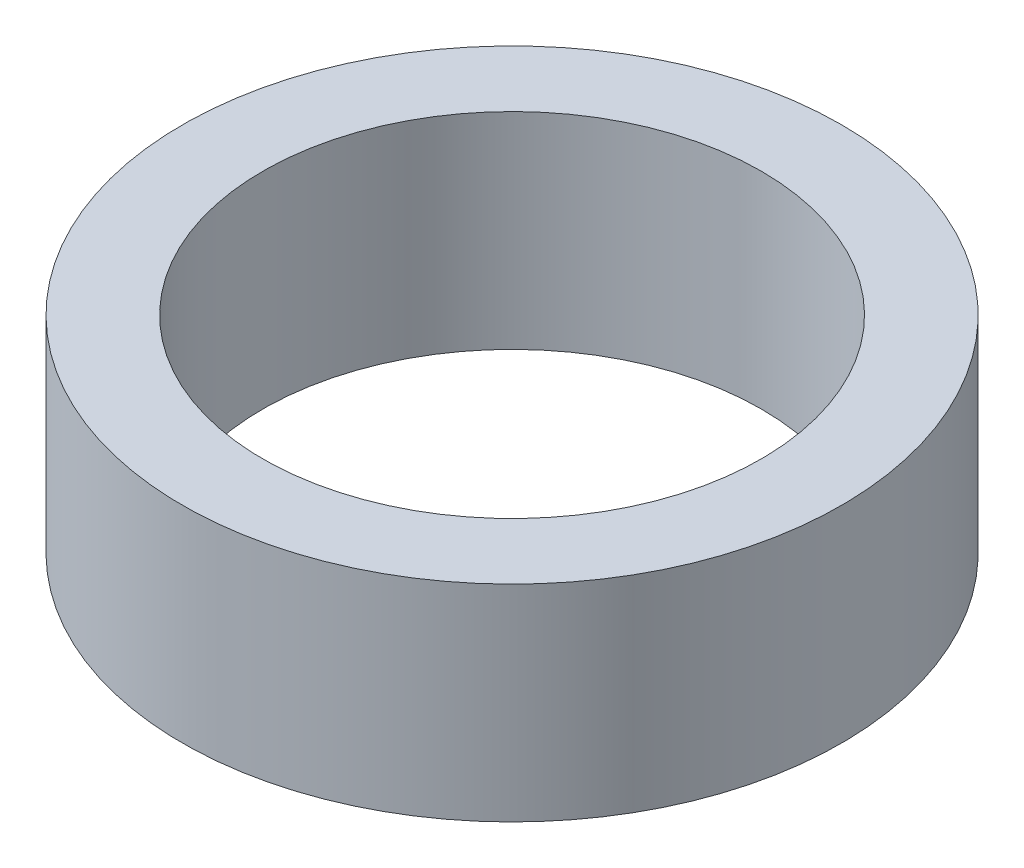
ISO-10303-21;
HEADER;
FILE_DESCRIPTION(('STEP AP214'),'2;1');
FILE_NAME('part.step','',(''),(''),'','','');
FILE_SCHEMA(('AUTOMOTIVE_DESIGN { 1 0 10303 214 1 1 1 1 }'));
ENDSEC;
DATA;
#1=APPLICATION_CONTEXT('core data for automotive mechanical design processes');
#2=APPLICATION_PROTOCOL_DEFINITION('international standard','automotive_design',2000,#1);
#3=PRODUCT_CONTEXT('',#1,'mechanical');
#4=PRODUCT('Part','Part','',(#3));
#5=PRODUCT_RELATED_PRODUCT_CATEGORY('part','',(#4));
#6=PRODUCT_DEFINITION_FORMATION('','',#4);
#7=PRODUCT_DEFINITION_CONTEXT('part definition',#1,'design');
#8=PRODUCT_DEFINITION('design','',#6,#7);
#9=PRODUCT_DEFINITION_SHAPE('','',#8);
#10=(LENGTH_UNIT() NAMED_UNIT(*) SI_UNIT(.MILLI.,.METRE.));
#11=(NAMED_UNIT(*) PLANE_ANGLE_UNIT() SI_UNIT($,.RADIAN.));
#12=(NAMED_UNIT(*) SI_UNIT($,.STERADIAN.) SOLID_ANGLE_UNIT());
#13=UNCERTAINTY_MEASURE_WITH_UNIT(LENGTH_MEASURE(1.E-05),#10,'distance_accuracy_value','');
#14=(GEOMETRIC_REPRESENTATION_CONTEXT(3) GLOBAL_UNCERTAINTY_ASSIGNED_CONTEXT((#13)) GLOBAL_UNIT_ASSIGNED_CONTEXT((#10,
#11,#12)) REPRESENTATION_CONTEXT('',''));
#15=CARTESIAN_POINT('',(0.,0.,0.));
#16=DIRECTION('',(0.,0.,1.));
#17=DIRECTION('',(1.,0.,0.));
#18=AXIS2_PLACEMENT_3D('',#15,#16,#17);
#19=CARTESIAN_POINT('',(0.,0.,0.));
#20=DIRECTION('',(0.,-1.,0.));
#21=DIRECTION('',(0.,0.,-1.));
#22=AXIS2_PLACEMENT_3D('',#19,#20,#21);
#23=CYLINDRICAL_SURFACE('',#22,6.05);
#24=CARTESIAN_POINT('',(0.,0.,0.));
#25=DIRECTION('',(0.,-1.,0.));
#26=DIRECTION('',(0.,0.,-1.));
#27=AXIS2_PLACEMENT_3D('',#24,#25,#26);
#28=CIRCLE('',#27,6.05);
#29=CARTESIAN_POINT('',(0.,0.,-6.05));
#30=VERTEX_POINT('',#29);
#31=EDGE_CURVE('E10',#30,#30,#28,.T.);
#32=ORIENTED_EDGE('',*,*,#31,.T.);
#33=EDGE_LOOP('',(#32));
#34=FACE_BOUND('',#33,.T.);
#35=CARTESIAN_POINT('',(0.,5.,0.));
#36=DIRECTION('',(0.,-1.,0.));
#37=DIRECTION('',(0.,0.,-1.));
#38=AXIS2_PLACEMENT_3D('',#35,#36,#37);
#39=CIRCLE('',#38,6.05);
#40=CARTESIAN_POINT('',(0.,5.,-6.05));
#41=VERTEX_POINT('',#40);
#42=EDGE_CURVE('E51',#41,#41,#39,.T.);
#43=ORIENTED_EDGE('',*,*,#42,.F.);
#44=EDGE_LOOP('',(#43));
#45=FACE_BOUND('',#44,.T.);
#46=ADVANCED_FACE('F37',(#34,#45),#23,.F.);
#47=CARTESIAN_POINT('',(6.05,0.,0.));
#48=DIRECTION('',(0.,-1.,0.));
#49=DIRECTION('',(0.,0.,-1.));
#50=AXIS2_PLACEMENT_3D('',#47,#48,#49);
#51=PLANE('',#50);
#52=CARTESIAN_POINT('',(0.,0.,0.));
#53=DIRECTION('',(0.,-1.,0.));
#54=DIRECTION('',(0.,0.,-1.));
#55=AXIS2_PLACEMENT_3D('',#52,#53,#54);
#56=CIRCLE('',#55,8.);
#57=CARTESIAN_POINT('',(0.,0.,-8.));
#58=VERTEX_POINT('',#57);
#59=EDGE_CURVE('E43',#58,#58,#56,.T.);
#60=ORIENTED_EDGE('',*,*,#59,.T.);
#61=EDGE_LOOP('',(#60));
#62=FACE_BOUND('',#61,.T.);
#63=ORIENTED_EDGE('',*,*,#31,.F.);
#64=EDGE_LOOP('',(#63));
#65=FACE_BOUND('',#64,.T.);
#66=ADVANCED_FACE('F61',(#62,#65),#51,.T.);
#67=CARTESIAN_POINT('',(0.,0.,0.));
#68=DIRECTION('',(0.,-1.,0.));
#69=DIRECTION('',(0.,0.,-1.));
#70=AXIS2_PLACEMENT_3D('',#67,#68,#69);
#71=CYLINDRICAL_SURFACE('',#70,8.);
#72=CARTESIAN_POINT('',(0.,5.,0.));
#73=DIRECTION('',(0.,-1.,0.));
#74=DIRECTION('',(0.,0.,-1.));
#75=AXIS2_PLACEMENT_3D('',#72,#73,#74);
#76=CIRCLE('',#75,8.);
#77=CARTESIAN_POINT('',(0.,5.,-8.));
#78=VERTEX_POINT('',#77);
#79=EDGE_CURVE('E47',#78,#78,#76,.T.);
#80=ORIENTED_EDGE('',*,*,#79,.T.);
#81=EDGE_LOOP('',(#80));
#82=FACE_BOUND('',#81,.T.);
#83=ORIENTED_EDGE('',*,*,#59,.F.);
#84=EDGE_LOOP('',(#83));
#85=FACE_BOUND('',#84,.T.);
#86=ADVANCED_FACE('F65',(#82,#85),#71,.T.);
#87=CARTESIAN_POINT('',(8.,5.,0.));
#88=DIRECTION('',(0.,1.,0.));
#89=DIRECTION('',(0.,0.,1.));
#90=AXIS2_PLACEMENT_3D('',#87,#88,#89);
#91=PLANE('',#90);
#92=ORIENTED_EDGE('',*,*,#42,.T.);
#93=EDGE_LOOP('',(#92));
#94=FACE_BOUND('',#93,.T.);
#95=ORIENTED_EDGE('',*,*,#79,.F.);
#96=EDGE_LOOP('',(#95));
#97=FACE_BOUND('',#96,.T.);
#98=ADVANCED_FACE('F57',(#94,#97),#91,.T.);
#99=CLOSED_SHELL('',(#46,#66,#86,#98));
#100=MANIFOLD_SOLID_BREP('B2',#99);
#101=ADVANCED_BREP_SHAPE_REPRESENTATION('',(#18,#100),#14);
#102=SHAPE_DEFINITION_REPRESENTATION(#9,#101);
ENDSEC;
END-ISO-10303-21;
